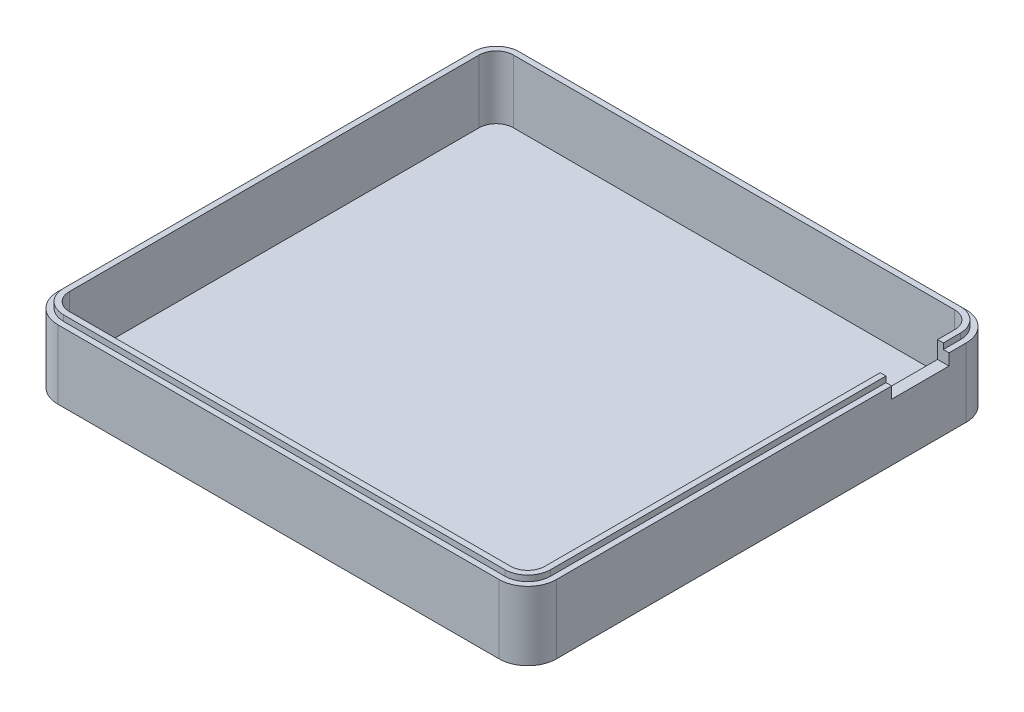
ISO-10303-21;
HEADER;
FILE_DESCRIPTION(('STEP AP214'),'2;1');
FILE_NAME('part.step','',(''),(''),'','','');
FILE_SCHEMA(('AUTOMOTIVE_DESIGN { 1 0 10303 214 1 1 1 1 }'));
ENDSEC;
DATA;
#1=APPLICATION_CONTEXT('core data for automotive mechanical design processes');
#2=APPLICATION_PROTOCOL_DEFINITION('international standard','automotive_design',2000,#1);
#3=PRODUCT_CONTEXT('',#1,'mechanical');
#4=PRODUCT('Part','Part','',(#3));
#5=PRODUCT_RELATED_PRODUCT_CATEGORY('part','',(#4));
#6=PRODUCT_DEFINITION_FORMATION('','',#4);
#7=PRODUCT_DEFINITION_CONTEXT('part definition',#1,'design');
#8=PRODUCT_DEFINITION('design','',#6,#7);
#9=PRODUCT_DEFINITION_SHAPE('','',#8);
#10=(LENGTH_UNIT() NAMED_UNIT(*) SI_UNIT(.MILLI.,.METRE.));
#11=(NAMED_UNIT(*) PLANE_ANGLE_UNIT() SI_UNIT($,.RADIAN.));
#12=(NAMED_UNIT(*) SI_UNIT($,.STERADIAN.) SOLID_ANGLE_UNIT());
#13=UNCERTAINTY_MEASURE_WITH_UNIT(LENGTH_MEASURE(1.E-05),#10,'distance_accuracy_value','');
#14=(GEOMETRIC_REPRESENTATION_CONTEXT(3) GLOBAL_UNCERTAINTY_ASSIGNED_CONTEXT((#13)) GLOBAL_UNIT_ASSIGNED_CONTEXT((#10,
#11,#12)) REPRESENTATION_CONTEXT('',''));
#15=CARTESIAN_POINT('',(0.,0.,0.));
#16=DIRECTION('',(0.,0.,1.));
#17=DIRECTION('',(1.,0.,0.));
#18=AXIS2_PLACEMENT_3D('',#15,#16,#17);
#19=CARTESIAN_POINT('',(83.9156253982292,13.,1.44944630586448));
#20=DIRECTION('',(-1.,0.,0.));
#21=DIRECTION('',(0.,0.,1.));
#22=AXIS2_PLACEMENT_3D('',#19,#20,#21);
#23=PLANE('',#22);
#24=DIRECTION('',(0.,0.,-1.));
#25=VECTOR('',#24,1.);
#26=CARTESIAN_POINT('',(83.9156253982292,13.,1.44944630586448));
#27=LINE('',#26,#25);
#28=CARTESIAN_POINT('',(83.9156253982292,13.,4.44944630586446));
#29=VERTEX_POINT('',#28);
#30=CARTESIAN_POINT('',(83.9156253982292,13.,1.44944630586446));
#31=VERTEX_POINT('',#30);
#32=EDGE_CURVE('E536',#29,#31,#27,.T.);
#33=ORIENTED_EDGE('',*,*,#32,.F.);
#34=DIRECTION('',(0.,1.,0.));
#35=VECTOR('',#34,1.);
#36=CARTESIAN_POINT('',(83.9156253982292,15.,4.44944630586446));
#37=LINE('',#36,#35);
#38=CARTESIAN_POINT('',(83.9156253982292,12.,4.44944630586446));
#39=VERTEX_POINT('',#38);
#40=EDGE_CURVE('E615',#39,#29,#37,.T.);
#41=ORIENTED_EDGE('',*,*,#40,.F.);
#42=DIRECTION('',(0.,0.,-1.));
#43=VECTOR('',#42,1.);
#44=CARTESIAN_POINT('',(83.9156253982292,12.,1.44944630586448));
#45=LINE('',#44,#43);
#46=CARTESIAN_POINT('',(83.9156253982292,12.,1.44944630586446));
#47=VERTEX_POINT('',#46);
#48=EDGE_CURVE('E317',#39,#47,#45,.T.);
#49=ORIENTED_EDGE('',*,*,#48,.T.);
#50=DIRECTION('',(0.,-1.,0.));
#51=VECTOR('',#50,1.);
#52=CARTESIAN_POINT('',(83.9156253982292,13.,1.44944630586446));
#53=LINE('',#52,#51);
#54=EDGE_CURVE('E331',#31,#47,#53,.T.);
#55=ORIENTED_EDGE('',*,*,#54,.F.);
#56=EDGE_LOOP('',(#33,#41,#49,#55));
#57=FACE_BOUND('',#56,.T.);
#58=ADVANCED_FACE('F86',(#57),#23,.F.);
#59=CARTESIAN_POINT('',(2.91562539822915,2.,1.44944630586448));
#60=DIRECTION('',(0.,1.,0.));
#61=DIRECTION('',(0.,0.,1.));
#62=AXIS2_PLACEMENT_3D('',#59,#60,#61);
#63=PLANE('',#62);
#64=CARTESIAN_POINT('',(2.91562539822915,2.,1.44944630586448));
#65=DIRECTION('',(0.,1.,0.));
#66=DIRECTION('',(0.,0.,1.));
#67=AXIS2_PLACEMENT_3D('',#64,#65,#66);
#68=CIRCLE('',#67,3.00000000000002);
#69=CARTESIAN_POINT('',(-0.0843746017708674,2.,1.44944630586448));
#70=VERTEX_POINT('',#69);
#71=CARTESIAN_POINT('',(2.91562539822915,2.,-1.55055369413554));
#72=VERTEX_POINT('',#71);
#73=EDGE_CURVE('E441',#70,#72,#68,.F.);
#74=ORIENTED_EDGE('',*,*,#73,.F.);
#75=DIRECTION('',(0.,0.,-1.));
#76=VECTOR('',#75,1.);
#77=CARTESIAN_POINT('',(-0.0843746017708674,2.,1.44944630586448));
#78=LINE('',#77,#76);
#79=CARTESIAN_POINT('',(-0.0843746017708674,2.,72.9494463058644));
#80=VERTEX_POINT('',#79);
#81=EDGE_CURVE('E438',#80,#70,#78,.T.);
#82=ORIENTED_EDGE('',*,*,#81,.F.);
#83=CARTESIAN_POINT('',(2.91562539822916,2.,72.9494463058644));
#84=DIRECTION('',(0.,1.,0.));
#85=DIRECTION('',(0.,0.,1.));
#86=AXIS2_PLACEMENT_3D('',#83,#84,#85);
#87=CIRCLE('',#86,3.00000000000001);
#88=CARTESIAN_POINT('',(2.91562539822916,2.,75.9494463058645));
#89=VERTEX_POINT('',#88);
#90=EDGE_CURVE('E435',#89,#80,#87,.F.);
#91=ORIENTED_EDGE('',*,*,#90,.F.);
#92=DIRECTION('',(-1.,0.,0.));
#93=VECTOR('',#92,1.);
#94=CARTESIAN_POINT('',(2.91562539822915,2.,75.9494463058645));
#95=LINE('',#94,#93);
#96=CARTESIAN_POINT('',(79.9156253982292,2.,75.9494463058645));
#97=VERTEX_POINT('',#96);
#98=EDGE_CURVE('E432',#97,#89,#95,.T.);
#99=ORIENTED_EDGE('',*,*,#98,.F.);
#100=CARTESIAN_POINT('',(79.9156253982292,2.,72.9494463058644));
#101=DIRECTION('',(0.,1.,0.));
#102=DIRECTION('',(0.,0.,1.));
#103=AXIS2_PLACEMENT_3D('',#100,#101,#102);
#104=CIRCLE('',#103,3.00000000000002);
#105=CARTESIAN_POINT('',(82.9156253982292,2.,72.9494463058644));
#106=VERTEX_POINT('',#105);
#107=EDGE_CURVE('E429',#106,#97,#104,.F.);
#108=ORIENTED_EDGE('',*,*,#107,.F.);
#109=DIRECTION('',(0.,0.,-1.));
#110=VECTOR('',#109,1.);
#111=CARTESIAN_POINT('',(82.9156253982292,2.,1.44944630586448));
#112=LINE('',#111,#110);
#113=CARTESIAN_POINT('',(82.9156253982292,2.,1.44944630586447));
#114=VERTEX_POINT('',#113);
#115=EDGE_CURVE('E425',#106,#114,#112,.T.);
#116=ORIENTED_EDGE('',*,*,#115,.T.);
#117=CARTESIAN_POINT('',(79.9156253982292,2.,1.44944630586447));
#118=DIRECTION('',(0.,1.,0.));
#119=DIRECTION('',(0.,0.,1.));
#120=AXIS2_PLACEMENT_3D('',#117,#118,#119);
#121=CIRCLE('',#120,3.00000000000002);
#122=CARTESIAN_POINT('',(79.9156253982292,2.,-1.55055369413555));
#123=VERTEX_POINT('',#122);
#124=EDGE_CURVE('E421',#114,#123,#121,.T.);
#125=ORIENTED_EDGE('',*,*,#124,.T.);
#126=DIRECTION('',(-1.,0.,0.));
#127=VECTOR('',#126,1.);
#128=CARTESIAN_POINT('',(2.91562539822915,2.,-1.55055369413554));
#129=LINE('',#128,#127);
#130=EDGE_CURVE('E417',#123,#72,#129,.T.);
#131=ORIENTED_EDGE('',*,*,#130,.T.);
#132=EDGE_LOOP('',(#74,#82,#91,#99,#108,#116,#125,#131));
#133=FACE_BOUND('',#132,.T.);
#134=ADVANCED_FACE('F697',(#133),#63,.T.);
#135=CARTESIAN_POINT('',(2.91562539822915,12.,-1.55055369413554));
#136=DIRECTION('',(0.,0.,-1.));
#137=DIRECTION('',(-1.,0.,0.));
#138=AXIS2_PLACEMENT_3D('',#135,#136,#137);
#139=PLANE('',#138);
#140=ORIENTED_EDGE('',*,*,#130,.F.);
#141=DIRECTION('',(0.,-1.,0.));
#142=VECTOR('',#141,1.);
#143=CARTESIAN_POINT('',(79.9156253982292,12.,-1.55055369413555));
#144=LINE('',#143,#142);
#145=CARTESIAN_POINT('',(79.9156253982292,13.,-1.55055369413555));
#146=VERTEX_POINT('',#145);
#147=EDGE_CURVE('E110',#146,#123,#144,.T.);
#148=ORIENTED_EDGE('',*,*,#147,.F.);
#149=DIRECTION('',(-1.,0.,0.));
#150=VECTOR('',#149,1.);
#151=CARTESIAN_POINT('',(2.91562539822915,13.,-1.55055369413554));
#152=LINE('',#151,#150);
#153=CARTESIAN_POINT('',(2.91562539822915,13.,-1.55055369413554));
#154=VERTEX_POINT('',#153);
#155=EDGE_CURVE('E645',#146,#154,#152,.T.);
#156=ORIENTED_EDGE('',*,*,#155,.T.);
#157=DIRECTION('',(0.,-1.,0.));
#158=VECTOR('',#157,1.);
#159=CARTESIAN_POINT('',(2.91562539822915,12.,-1.55055369413554));
#160=LINE('',#159,#158);
#161=EDGE_CURVE('E357',#154,#72,#160,.T.);
#162=ORIENTED_EDGE('',*,*,#161,.T.);
#163=EDGE_LOOP('',(#140,#148,#156,#162));
#164=FACE_BOUND('',#163,.T.);
#165=ADVANCED_FACE('F713',(#164),#139,.F.);
#166=CARTESIAN_POINT('',(79.9156253982292,12.,1.44944630586447));
#167=DIRECTION('',(0.,-1.,0.));
#168=DIRECTION('',(0.,0.,-1.));
#169=AXIS2_PLACEMENT_3D('',#166,#167,#168);
#170=CYLINDRICAL_SURFACE('',#169,3.00000000000002);
#171=ORIENTED_EDGE('',*,*,#124,.F.);
#172=DIRECTION('',(0.,-1.,0.));
#173=VECTOR('',#172,1.);
#174=CARTESIAN_POINT('',(82.9156253982292,12.,1.44944630586447));
#175=LINE('',#174,#173);
#176=CARTESIAN_POINT('',(82.9156253982292,13.,1.44944630586446));
#177=VERTEX_POINT('',#176);
#178=EDGE_CURVE('E362',#177,#114,#175,.T.);
#179=ORIENTED_EDGE('',*,*,#178,.F.);
#180=CARTESIAN_POINT('',(79.9156253982292,13.,1.44944630586447));
#181=DIRECTION('',(0.,1.,0.));
#182=DIRECTION('',(0.,0.,1.));
#183=AXIS2_PLACEMENT_3D('',#180,#181,#182);
#184=CIRCLE('',#183,3.00000000000002);
#185=EDGE_CURVE('E642',#177,#146,#184,.T.);
#186=ORIENTED_EDGE('',*,*,#185,.T.);
#187=ORIENTED_EDGE('',*,*,#147,.T.);
#188=EDGE_LOOP('',(#171,#179,#186,#187));
#189=FACE_BOUND('',#188,.T.);
#190=ADVANCED_FACE('F693',(#189),#170,.F.);
#191=CARTESIAN_POINT('',(82.9156253982292,12.,1.44944630586447));
#192=DIRECTION('',(1.,0.,0.));
#193=DIRECTION('',(0.,0.,-1.));
#194=AXIS2_PLACEMENT_3D('',#191,#192,#193);
#195=PLANE('',#194);
#196=DIRECTION('',(0.,0.,1.));
#197=VECTOR('',#196,1.);
#198=CARTESIAN_POINT('',(82.9156253982292,10.,14.4494463058645));
#199=LINE('',#198,#197);
#200=CARTESIAN_POINT('',(82.9156253982292,10.,4.44944630586446));
#201=VERTEX_POINT('',#200);
#202=CARTESIAN_POINT('',(82.9156253982292,10.,14.4494463058645));
#203=VERTEX_POINT('',#202);
#204=EDGE_CURVE('E633',#201,#203,#199,.T.);
#205=ORIENTED_EDGE('',*,*,#204,.F.);
#206=DIRECTION('',(0.,-1.,0.));
#207=VECTOR('',#206,1.);
#208=CARTESIAN_POINT('',(82.9156253982292,15.,4.44944630586446));
#209=LINE('',#208,#207);
#210=CARTESIAN_POINT('',(82.9156253982292,13.,4.44944630586446));
#211=VERTEX_POINT('',#210);
#212=EDGE_CURVE('E308',#211,#201,#209,.T.);
#213=ORIENTED_EDGE('',*,*,#212,.F.);
#214=DIRECTION('',(0.,0.,-1.));
#215=VECTOR('',#214,1.);
#216=CARTESIAN_POINT('',(82.9156253982292,13.,1.44944630586448));
#217=LINE('',#216,#215);
#218=EDGE_CURVE('E666',#211,#177,#217,.T.);
#219=ORIENTED_EDGE('',*,*,#218,.T.);
#220=ORIENTED_EDGE('',*,*,#178,.T.);
#221=ORIENTED_EDGE('',*,*,#115,.F.);
#222=DIRECTION('',(0.,-1.,0.));
#223=VECTOR('',#222,1.);
#224=CARTESIAN_POINT('',(82.9156253982292,12.,72.9494463058644));
#225=LINE('',#224,#223);
#226=CARTESIAN_POINT('',(82.9156253982292,13.,72.9494463058644));
#227=VERTEX_POINT('',#226);
#228=EDGE_CURVE('E366',#227,#106,#225,.T.);
#229=ORIENTED_EDGE('',*,*,#228,.F.);
#230=CARTESIAN_POINT('',(82.9156253982292,13.,14.4494463058645));
#231=VERTEX_POINT('',#230);
#232=EDGE_CURVE('E560',#227,#231,#217,.T.);
#233=ORIENTED_EDGE('',*,*,#232,.T.);
#234=DIRECTION('',(0.,1.,0.));
#235=VECTOR('',#234,1.);
#236=CARTESIAN_POINT('',(82.9156253982292,15.,14.4494463058645));
#237=LINE('',#236,#235);
#238=EDGE_CURVE('E102',#203,#231,#237,.T.);
#239=ORIENTED_EDGE('',*,*,#238,.F.);
#240=EDGE_LOOP('',(#205,#213,#219,#220,#221,#229,#233,#239));
#241=FACE_BOUND('',#240,.T.);
#242=ADVANCED_FACE('F678',(#241),#195,.F.);
#243=CARTESIAN_POINT('',(79.9156253982292,12.,72.9494463058644));
#244=DIRECTION('',(0.,-1.,0.));
#245=DIRECTION('',(0.,0.,-1.));
#246=AXIS2_PLACEMENT_3D('',#243,#244,#245);
#247=CYLINDRICAL_SURFACE('',#246,3.00000000000002);
#248=ORIENTED_EDGE('',*,*,#228,.T.);
#249=ORIENTED_EDGE('',*,*,#107,.T.);
#250=DIRECTION('',(0.,-1.,0.));
#251=VECTOR('',#250,1.);
#252=CARTESIAN_POINT('',(79.9156253982292,12.,75.9494463058645));
#253=LINE('',#252,#251);
#254=CARTESIAN_POINT('',(79.9156253982292,13.,75.9494463058645));
#255=VERTEX_POINT('',#254);
#256=EDGE_CURVE('E370',#255,#97,#253,.T.);
#257=ORIENTED_EDGE('',*,*,#256,.F.);
#258=CARTESIAN_POINT('',(79.9156253982292,13.,72.9494463058644));
#259=DIRECTION('',(0.,1.,0.));
#260=DIRECTION('',(0.,0.,1.));
#261=AXIS2_PLACEMENT_3D('',#258,#259,#260);
#262=CIRCLE('',#261,3.00000000000002);
#263=EDGE_CURVE('E663',#255,#227,#262,.T.);
#264=ORIENTED_EDGE('',*,*,#263,.T.);
#265=EDGE_LOOP('',(#248,#249,#257,#264));
#266=FACE_BOUND('',#265,.T.);
#267=ADVANCED_FACE('F700',(#266),#247,.F.);
#268=CARTESIAN_POINT('',(2.91562539822918,12.,75.9494463058645));
#269=DIRECTION('',(0.,0.,-1.));
#270=DIRECTION('',(-1.,0.,0.));
#271=AXIS2_PLACEMENT_3D('',#268,#269,#270);
#272=PLANE('',#271);
#273=ORIENTED_EDGE('',*,*,#256,.T.);
#274=ORIENTED_EDGE('',*,*,#98,.T.);
#275=DIRECTION('',(0.,-1.,0.));
#276=VECTOR('',#275,1.);
#277=CARTESIAN_POINT('',(2.91562539822916,12.,75.9494463058645));
#278=LINE('',#277,#276);
#279=CARTESIAN_POINT('',(2.91562539822915,13.,75.9494463058645));
#280=VERTEX_POINT('',#279);
#281=EDGE_CURVE('E374',#280,#89,#278,.T.);
#282=ORIENTED_EDGE('',*,*,#281,.F.);
#283=DIRECTION('',(-1.,0.,0.));
#284=VECTOR('',#283,1.);
#285=CARTESIAN_POINT('',(2.91562539822915,13.,75.9494463058645));
#286=LINE('',#285,#284);
#287=EDGE_CURVE('E660',#255,#280,#286,.T.);
#288=ORIENTED_EDGE('',*,*,#287,.F.);
#289=EDGE_LOOP('',(#273,#274,#282,#288));
#290=FACE_BOUND('',#289,.T.);
#291=ADVANCED_FACE('F703',(#290),#272,.T.);
#292=CARTESIAN_POINT('',(2.91562539822916,12.,72.9494463058644));
#293=DIRECTION('',(0.,-1.,0.));
#294=DIRECTION('',(0.,0.,-1.));
#295=AXIS2_PLACEMENT_3D('',#292,#293,#294);
#296=CYLINDRICAL_SURFACE('',#295,3.00000000000001);
#297=ORIENTED_EDGE('',*,*,#281,.T.);
#298=ORIENTED_EDGE('',*,*,#90,.T.);
#299=DIRECTION('',(0.,-1.,0.));
#300=VECTOR('',#299,1.);
#301=CARTESIAN_POINT('',(-0.0843746017708674,12.,72.9494463058644));
#302=LINE('',#301,#300);
#303=CARTESIAN_POINT('',(-0.0843746017708574,13.,72.9494463058644));
#304=VERTEX_POINT('',#303);
#305=EDGE_CURVE('E378',#304,#80,#302,.T.);
#306=ORIENTED_EDGE('',*,*,#305,.F.);
#307=CARTESIAN_POINT('',(2.91562539822916,13.,72.9494463058644));
#308=DIRECTION('',(0.,1.,0.));
#309=DIRECTION('',(0.,0.,1.));
#310=AXIS2_PLACEMENT_3D('',#307,#308,#309);
#311=CIRCLE('',#310,3.00000000000001);
#312=EDGE_CURVE('E656',#304,#280,#311,.T.);
#313=ORIENTED_EDGE('',*,*,#312,.T.);
#314=EDGE_LOOP('',(#297,#298,#306,#313));
#315=FACE_BOUND('',#314,.T.);
#316=ADVANCED_FACE('F707',(#315),#296,.F.);
#317=CARTESIAN_POINT('',(-0.0843746017708674,12.,1.44944630586448));
#318=DIRECTION('',(1.,0.,0.));
#319=DIRECTION('',(0.,0.,-1.));
#320=AXIS2_PLACEMENT_3D('',#317,#318,#319);
#321=PLANE('',#320);
#322=ORIENTED_EDGE('',*,*,#305,.T.);
#323=ORIENTED_EDGE('',*,*,#81,.T.);
#324=DIRECTION('',(0.,-1.,0.));
#325=VECTOR('',#324,1.);
#326=CARTESIAN_POINT('',(-0.0843746017708674,12.,1.44944630586448));
#327=LINE('',#326,#325);
#328=CARTESIAN_POINT('',(-0.0843746017708674,13.,1.44944630586448));
#329=VERTEX_POINT('',#328);
#330=EDGE_CURVE('E382',#329,#70,#327,.T.);
#331=ORIENTED_EDGE('',*,*,#330,.F.);
#332=DIRECTION('',(0.,0.,-1.));
#333=VECTOR('',#332,1.);
#334=CARTESIAN_POINT('',(-0.0843746017708674,13.,1.44944630586448));
#335=LINE('',#334,#333);
#336=EDGE_CURVE('E652',#304,#329,#335,.T.);
#337=ORIENTED_EDGE('',*,*,#336,.F.);
#338=EDGE_LOOP('',(#322,#323,#331,#337));
#339=FACE_BOUND('',#338,.T.);
#340=ADVANCED_FACE('F710',(#339),#321,.T.);
#341=CARTESIAN_POINT('',(2.91562539822915,12.,1.44944630586448));
#342=DIRECTION('',(0.,-1.,0.));
#343=DIRECTION('',(0.,0.,-1.));
#344=AXIS2_PLACEMENT_3D('',#341,#342,#343);
#345=CYLINDRICAL_SURFACE('',#344,3.00000000000002);
#346=ORIENTED_EDGE('',*,*,#330,.T.);
#347=ORIENTED_EDGE('',*,*,#73,.T.);
#348=ORIENTED_EDGE('',*,*,#161,.F.);
#349=CARTESIAN_POINT('',(2.91562539822915,13.,1.44944630586448));
#350=DIRECTION('',(0.,1.,0.));
#351=DIRECTION('',(0.,0.,1.));
#352=AXIS2_PLACEMENT_3D('',#349,#350,#351);
#353=CIRCLE('',#352,3.00000000000002);
#354=EDGE_CURVE('E648',#154,#329,#353,.T.);
#355=ORIENTED_EDGE('',*,*,#354,.T.);
#356=EDGE_LOOP('',(#346,#347,#348,#355));
#357=FACE_BOUND('',#356,.T.);
#358=ADVANCED_FACE('F712',(#357),#345,.F.);
#359=CARTESIAN_POINT('',(2.91562539822915,2.,1.44944630586448));
#360=DIRECTION('',(0.,-1.,0.));
#361=DIRECTION('',(0.,0.,-1.));
#362=AXIS2_PLACEMENT_3D('',#359,#360,#361);
#363=CYLINDRICAL_SURFACE('',#362,5.00000000000002);
#364=CARTESIAN_POINT('',(2.91562539822915,0.,1.44944630586448));
#365=DIRECTION('',(0.,1.,0.));
#366=DIRECTION('',(0.,0.,1.));
#367=AXIS2_PLACEMENT_3D('',#364,#365,#366);
#368=CIRCLE('',#367,5.00000000000002);
#369=CARTESIAN_POINT('',(2.91562539822915,0.,-3.55055369413555));
#370=VERTEX_POINT('',#369);
#371=CARTESIAN_POINT('',(-2.08437460177085,0.,1.44944630586448));
#372=VERTEX_POINT('',#371);
#373=EDGE_CURVE('E445',#370,#372,#368,.T.);
#374=ORIENTED_EDGE('',*,*,#373,.T.);
#375=DIRECTION('',(0.,-1.,0.));
#376=VECTOR('',#375,1.);
#377=CARTESIAN_POINT('',(-2.08437460177085,2.,1.44944630586448));
#378=LINE('',#377,#376);
#379=CARTESIAN_POINT('',(-2.08437460177085,12.,1.44944630586448));
#380=VERTEX_POINT('',#379);
#381=EDGE_CURVE('E12',#380,#372,#378,.T.);
#382=ORIENTED_EDGE('',*,*,#381,.F.);
#383=CARTESIAN_POINT('',(2.91562539822915,12.,1.44944630586448));
#384=DIRECTION('',(0.,1.,0.));
#385=DIRECTION('',(0.,0.,1.));
#386=AXIS2_PLACEMENT_3D('',#383,#384,#385);
#387=CIRCLE('',#386,5.00000000000002);
#388=CARTESIAN_POINT('',(2.91562539822915,12.,-3.55055369413555));
#389=VERTEX_POINT('',#388);
#390=EDGE_CURVE('E386',#389,#380,#387,.T.);
#391=ORIENTED_EDGE('',*,*,#390,.F.);
#392=DIRECTION('',(0.,-1.,0.));
#393=VECTOR('',#392,1.);
#394=CARTESIAN_POINT('',(2.91562539822915,2.,-3.55055369413555));
#395=LINE('',#394,#393);
#396=EDGE_CURVE('E474',#389,#370,#395,.T.);
#397=ORIENTED_EDGE('',*,*,#396,.T.);
#398=EDGE_LOOP('',(#374,#382,#391,#397));
#399=FACE_BOUND('',#398,.T.);
#400=ADVANCED_FACE('F88',(#399),#363,.T.);
#401=CARTESIAN_POINT('',(-2.08437460177085,2.,1.44944630586448));
#402=DIRECTION('',(1.,0.,0.));
#403=DIRECTION('',(0.,0.,-1.));
#404=AXIS2_PLACEMENT_3D('',#401,#402,#403);
#405=PLANE('',#404);
#406=DIRECTION('',(0.,0.,1.));
#407=VECTOR('',#406,1.);
#408=CARTESIAN_POINT('',(-2.08437460177085,0.,1.44944630586448));
#409=LINE('',#408,#407);
#410=CARTESIAN_POINT('',(-2.08437460177085,0.,72.9494463058644));
#411=VERTEX_POINT('',#410);
#412=EDGE_CURVE('E449',#372,#411,#409,.T.);
#413=ORIENTED_EDGE('',*,*,#412,.T.);
#414=DIRECTION('',(0.,-1.,0.));
#415=VECTOR('',#414,1.);
#416=CARTESIAN_POINT('',(-2.08437460177085,2.,72.9494463058644));
#417=LINE('',#416,#415);
#418=CARTESIAN_POINT('',(-2.08437460177085,12.,72.9494463058644));
#419=VERTEX_POINT('',#418);
#420=EDGE_CURVE('E95',#419,#411,#417,.T.);
#421=ORIENTED_EDGE('',*,*,#420,.F.);
#422=DIRECTION('',(0.,0.,1.));
#423=VECTOR('',#422,1.);
#424=CARTESIAN_POINT('',(-2.08437460177085,12.,1.44944630586448));
#425=LINE('',#424,#423);
#426=EDGE_CURVE('E390',#380,#419,#425,.T.);
#427=ORIENTED_EDGE('',*,*,#426,.F.);
#428=ORIENTED_EDGE('',*,*,#381,.T.);
#429=EDGE_LOOP('',(#413,#421,#427,#428));
#430=FACE_BOUND('',#429,.T.);
#431=ADVANCED_FACE('F515',(#430),#405,.F.);
#432=CARTESIAN_POINT('',(2.91562539822916,2.,72.9494463058644));
#433=DIRECTION('',(0.,-1.,0.));
#434=DIRECTION('',(0.,0.,-1.));
#435=AXIS2_PLACEMENT_3D('',#432,#433,#434);
#436=CYLINDRICAL_SURFACE('',#435,5.00000000000001);
#437=CARTESIAN_POINT('',(2.91562539822916,0.,72.9494463058644));
#438=DIRECTION('',(0.,1.,0.));
#439=DIRECTION('',(0.,0.,1.));
#440=AXIS2_PLACEMENT_3D('',#437,#438,#439);
#441=CIRCLE('',#440,5.00000000000001);
#442=CARTESIAN_POINT('',(2.91562539822916,0.,77.9494463058645));
#443=VERTEX_POINT('',#442);
#444=EDGE_CURVE('E452',#411,#443,#441,.T.);
#445=ORIENTED_EDGE('',*,*,#444,.T.);
#446=DIRECTION('',(0.,-1.,0.));
#447=VECTOR('',#446,1.);
#448=CARTESIAN_POINT('',(2.91562539822916,2.,77.9494463058645));
#449=LINE('',#448,#447);
#450=CARTESIAN_POINT('',(2.91562539822916,12.,77.9494463058645));
#451=VERTEX_POINT('',#450);
#452=EDGE_CURVE('E490',#451,#443,#449,.T.);
#453=ORIENTED_EDGE('',*,*,#452,.F.);
#454=CARTESIAN_POINT('',(2.91562539822916,12.,72.9494463058644));
#455=DIRECTION('',(0.,1.,0.));
#456=DIRECTION('',(0.,0.,1.));
#457=AXIS2_PLACEMENT_3D('',#454,#455,#456);
#458=CIRCLE('',#457,5.00000000000001);
#459=EDGE_CURVE('E394',#419,#451,#458,.T.);
#460=ORIENTED_EDGE('',*,*,#459,.F.);
#461=ORIENTED_EDGE('',*,*,#420,.T.);
#462=EDGE_LOOP('',(#445,#453,#460,#461));
#463=FACE_BOUND('',#462,.T.);
#464=ADVANCED_FACE('F498',(#463),#436,.T.);
#465=CARTESIAN_POINT('',(2.91562539822919,2.,77.9494463058645));
#466=DIRECTION('',(0.,0.,-1.));
#467=DIRECTION('',(-1.,0.,0.));
#468=AXIS2_PLACEMENT_3D('',#465,#466,#467);
#469=PLANE('',#468);
#470=DIRECTION('',(1.,0.,0.));
#471=VECTOR('',#470,1.);
#472=CARTESIAN_POINT('',(2.91562539822919,0.,77.9494463058645));
#473=LINE('',#472,#471);
#474=CARTESIAN_POINT('',(79.9156253982292,0.,77.9494463058645));
#475=VERTEX_POINT('',#474);
#476=EDGE_CURVE('E455',#443,#475,#473,.T.);
#477=ORIENTED_EDGE('',*,*,#476,.T.);
#478=DIRECTION('',(0.,-1.,0.));
#479=VECTOR('',#478,1.);
#480=CARTESIAN_POINT('',(79.9156253982292,2.,77.9494463058645));
#481=LINE('',#480,#479);
#482=CARTESIAN_POINT('',(79.9156253982292,12.,77.9494463058645));
#483=VERTEX_POINT('',#482);
#484=EDGE_CURVE('E486',#483,#475,#481,.T.);
#485=ORIENTED_EDGE('',*,*,#484,.F.);
#486=DIRECTION('',(1.,0.,0.));
#487=VECTOR('',#486,1.);
#488=CARTESIAN_POINT('',(2.91562539822919,12.,77.9494463058645));
#489=LINE('',#488,#487);
#490=EDGE_CURVE('E398',#451,#483,#489,.T.);
#491=ORIENTED_EDGE('',*,*,#490,.F.);
#492=ORIENTED_EDGE('',*,*,#452,.T.);
#493=EDGE_LOOP('',(#477,#485,#491,#492));
#494=FACE_BOUND('',#493,.T.);
#495=ADVANCED_FACE('F507',(#494),#469,.F.);
#496=CARTESIAN_POINT('',(79.9156253982292,2.,72.9494463058644));
#497=DIRECTION('',(0.,-1.,0.));
#498=DIRECTION('',(0.,0.,-1.));
#499=AXIS2_PLACEMENT_3D('',#496,#497,#498);
#500=CYLINDRICAL_SURFACE('',#499,5.00000000000001);
#501=CARTESIAN_POINT('',(79.9156253982292,0.,72.9494463058644));
#502=DIRECTION('',(0.,1.,0.));
#503=DIRECTION('',(0.,0.,1.));
#504=AXIS2_PLACEMENT_3D('',#501,#502,#503);
#505=CIRCLE('',#504,5.00000000000001);
#506=CARTESIAN_POINT('',(84.9156253982292,0.,72.9494463058644));
#507=VERTEX_POINT('',#506);
#508=EDGE_CURVE('E458',#475,#507,#505,.T.);
#509=ORIENTED_EDGE('',*,*,#508,.T.);
#510=DIRECTION('',(0.,-1.,0.));
#511=VECTOR('',#510,1.);
#512=CARTESIAN_POINT('',(84.9156253982292,2.,72.9494463058644));
#513=LINE('',#512,#511);
#514=CARTESIAN_POINT('',(84.9156253982292,12.,72.9494463058644));
#515=VERTEX_POINT('',#514);
#516=EDGE_CURVE('E483',#515,#507,#513,.T.);
#517=ORIENTED_EDGE('',*,*,#516,.F.);
#518=CARTESIAN_POINT('',(79.9156253982292,12.,72.9494463058644));
#519=DIRECTION('',(0.,1.,0.));
#520=DIRECTION('',(0.,0.,1.));
#521=AXIS2_PLACEMENT_3D('',#518,#519,#520);
#522=CIRCLE('',#521,5.00000000000001);
#523=EDGE_CURVE('E402',#483,#515,#522,.T.);
#524=ORIENTED_EDGE('',*,*,#523,.F.);
#525=ORIENTED_EDGE('',*,*,#484,.T.);
#526=EDGE_LOOP('',(#509,#517,#524,#525));
#527=FACE_BOUND('',#526,.T.);
#528=ADVANCED_FACE('F511',(#527),#500,.T.);
#529=CARTESIAN_POINT('',(84.9156253982292,2.,1.44944630586447));
#530=DIRECTION('',(1.,0.,0.));
#531=DIRECTION('',(0.,0.,-1.));
#532=AXIS2_PLACEMENT_3D('',#529,#530,#531);
#533=PLANE('',#532);
#534=DIRECTION('',(0.,1.,0.));
#535=VECTOR('',#534,1.);
#536=CARTESIAN_POINT('',(84.9156253982292,15.,4.44944630586446));
#537=LINE('',#536,#535);
#538=CARTESIAN_POINT('',(84.9156253982292,10.,4.44944630586446));
#539=VERTEX_POINT('',#538);
#540=CARTESIAN_POINT('',(84.9156253982292,12.,4.44944630586446));
#541=VERTEX_POINT('',#540);
#542=EDGE_CURVE('E619',#539,#541,#537,.T.);
#543=ORIENTED_EDGE('',*,*,#542,.F.);
#544=DIRECTION('',(0.,0.,-1.));
#545=VECTOR('',#544,1.);
#546=CARTESIAN_POINT('',(84.9156253982292,10.,14.4494463058645));
#547=LINE('',#546,#545);
#548=CARTESIAN_POINT('',(84.9156253982292,10.,14.4494463058645));
#549=VERTEX_POINT('',#548);
#550=EDGE_CURVE('E621',#549,#539,#547,.T.);
#551=ORIENTED_EDGE('',*,*,#550,.F.);
#552=DIRECTION('',(0.,-1.,0.));
#553=VECTOR('',#552,1.);
#554=CARTESIAN_POINT('',(84.9156253982292,15.,14.4494463058645));
#555=LINE('',#554,#553);
#556=CARTESIAN_POINT('',(84.9156253982292,12.,14.4494463058645));
#557=VERTEX_POINT('',#556);
#558=EDGE_CURVE('E296',#557,#549,#555,.T.);
#559=ORIENTED_EDGE('',*,*,#558,.F.);
#560=DIRECTION('',(0.,0.,1.));
#561=VECTOR('',#560,1.);
#562=CARTESIAN_POINT('',(84.9156253982292,12.,1.44944630586447));
#563=LINE('',#562,#561);
#564=EDGE_CURVE('E306',#557,#515,#563,.T.);
#565=ORIENTED_EDGE('',*,*,#564,.T.);
#566=ORIENTED_EDGE('',*,*,#516,.T.);
#567=DIRECTION('',(0.,0.,1.));
#568=VECTOR('',#567,1.);
#569=CARTESIAN_POINT('',(84.9156253982292,0.,1.44944630586447));
#570=LINE('',#569,#568);
#571=CARTESIAN_POINT('',(84.9156253982292,0.,1.44944630586447));
#572=VERTEX_POINT('',#571);
#573=EDGE_CURVE('E462',#572,#507,#570,.T.);
#574=ORIENTED_EDGE('',*,*,#573,.F.);
#575=DIRECTION('',(0.,-1.,0.));
#576=VECTOR('',#575,1.);
#577=CARTESIAN_POINT('',(84.9156253982292,2.,1.44944630586447));
#578=LINE('',#577,#576);
#579=CARTESIAN_POINT('',(84.9156253982292,12.,1.44944630586447));
#580=VERTEX_POINT('',#579);
#581=EDGE_CURVE('E480',#580,#572,#578,.T.);
#582=ORIENTED_EDGE('',*,*,#581,.F.);
#583=EDGE_CURVE('E405',#580,#541,#563,.T.);
#584=ORIENTED_EDGE('',*,*,#583,.T.);
#585=EDGE_LOOP('',(#543,#551,#559,#565,#566,#574,#582,#584));
#586=FACE_BOUND('',#585,.T.);
#587=ADVANCED_FACE('F527',(#586),#533,.T.);
#588=CARTESIAN_POINT('',(79.9156253982292,2.,1.44944630586447));
#589=DIRECTION('',(0.,-1.,0.));
#590=DIRECTION('',(0.,0.,-1.));
#591=AXIS2_PLACEMENT_3D('',#588,#589,#590);
#592=CYLINDRICAL_SURFACE('',#591,5.);
#593=CARTESIAN_POINT('',(79.9156253982292,0.,1.44944630586447));
#594=DIRECTION('',(0.,-1.,0.));
#595=DIRECTION('',(0.,0.,-1.));
#596=AXIS2_PLACEMENT_3D('',#593,#594,#595);
#597=CIRCLE('',#596,5.);
#598=CARTESIAN_POINT('',(79.9156253982292,0.,-3.55055369413554));
#599=VERTEX_POINT('',#598);
#600=EDGE_CURVE('E466',#599,#572,#597,.T.);
#601=ORIENTED_EDGE('',*,*,#600,.F.);
#602=DIRECTION('',(0.,-1.,0.));
#603=VECTOR('',#602,1.);
#604=CARTESIAN_POINT('',(79.9156253982292,2.,-3.55055369413554));
#605=LINE('',#604,#603);
#606=CARTESIAN_POINT('',(79.9156253982292,12.,-3.55055369413554));
#607=VERTEX_POINT('',#606);
#608=EDGE_CURVE('E477',#607,#599,#605,.T.);
#609=ORIENTED_EDGE('',*,*,#608,.F.);
#610=CARTESIAN_POINT('',(79.9156253982292,12.,1.44944630586447));
#611=DIRECTION('',(0.,-1.,0.));
#612=DIRECTION('',(0.,0.,-1.));
#613=AXIS2_PLACEMENT_3D('',#610,#611,#612);
#614=CIRCLE('',#613,5.);
#615=EDGE_CURVE('E409',#607,#580,#614,.T.);
#616=ORIENTED_EDGE('',*,*,#615,.T.);
#617=ORIENTED_EDGE('',*,*,#581,.T.);
#618=EDGE_LOOP('',(#601,#609,#616,#617));
#619=FACE_BOUND('',#618,.T.);
#620=ADVANCED_FACE('F523',(#619),#592,.T.);
#621=CARTESIAN_POINT('',(2.91562539822915,2.,-3.55055369413555));
#622=DIRECTION('',(0.,0.,-1.));
#623=DIRECTION('',(-1.,0.,0.));
#624=AXIS2_PLACEMENT_3D('',#621,#622,#623);
#625=PLANE('',#624);
#626=DIRECTION('',(1.,0.,0.));
#627=VECTOR('',#626,1.);
#628=CARTESIAN_POINT('',(2.91562539822915,0.,-3.55055369413555));
#629=LINE('',#628,#627);
#630=EDGE_CURVE('E470',#370,#599,#629,.T.);
#631=ORIENTED_EDGE('',*,*,#630,.F.);
#632=ORIENTED_EDGE('',*,*,#396,.F.);
#633=DIRECTION('',(1.,0.,0.));
#634=VECTOR('',#633,1.);
#635=CARTESIAN_POINT('',(2.91562539822915,12.,-3.55055369413555));
#636=LINE('',#635,#634);
#637=EDGE_CURVE('E413',#389,#607,#636,.T.);
#638=ORIENTED_EDGE('',*,*,#637,.T.);
#639=ORIENTED_EDGE('',*,*,#608,.T.);
#640=EDGE_LOOP('',(#631,#632,#638,#639));
#641=FACE_BOUND('',#640,.T.);
#642=ADVANCED_FACE('F519',(#641),#625,.T.);
#643=CARTESIAN_POINT('',(2.91562539822915,0.,1.44944630586448));
#644=DIRECTION('',(0.,1.,0.));
#645=DIRECTION('',(0.,0.,1.));
#646=AXIS2_PLACEMENT_3D('',#643,#644,#645);
#647=PLANE('',#646);
#648=ORIENTED_EDGE('',*,*,#373,.F.);
#649=ORIENTED_EDGE('',*,*,#630,.T.);
#650=ORIENTED_EDGE('',*,*,#600,.T.);
#651=ORIENTED_EDGE('',*,*,#573,.T.);
#652=ORIENTED_EDGE('',*,*,#508,.F.);
#653=ORIENTED_EDGE('',*,*,#476,.F.);
#654=ORIENTED_EDGE('',*,*,#444,.F.);
#655=ORIENTED_EDGE('',*,*,#412,.F.);
#656=EDGE_LOOP('',(#648,#649,#650,#651,#652,#653,#654,#655));
#657=FACE_BOUND('',#656,.T.);
#658=ADVANCED_FACE('F504',(#657),#647,.F.);
#659=CARTESIAN_POINT('',(2.91562539822915,12.,1.44944630586448));
#660=DIRECTION('',(0.,1.,0.));
#661=DIRECTION('',(0.,0.,1.));
#662=AXIS2_PLACEMENT_3D('',#659,#660,#661);
#663=PLANE('',#662);
#664=DIRECTION('',(1.,0.,0.));
#665=VECTOR('',#664,1.);
#666=CARTESIAN_POINT('',(-2.08537460177087,12.,4.44944630586446));
#667=LINE('',#666,#665);
#668=EDGE_CURVE('E309',#39,#541,#667,.T.);
#669=ORIENTED_EDGE('',*,*,#668,.T.);
#670=ORIENTED_EDGE('',*,*,#583,.F.);
#671=ORIENTED_EDGE('',*,*,#615,.F.);
#672=ORIENTED_EDGE('',*,*,#637,.F.);
#673=ORIENTED_EDGE('',*,*,#390,.T.);
#674=ORIENTED_EDGE('',*,*,#426,.T.);
#675=ORIENTED_EDGE('',*,*,#459,.T.);
#676=ORIENTED_EDGE('',*,*,#490,.T.);
#677=ORIENTED_EDGE('',*,*,#523,.T.);
#678=ORIENTED_EDGE('',*,*,#564,.F.);
#679=DIRECTION('',(-1.,0.,0.));
#680=VECTOR('',#679,1.);
#681=CARTESIAN_POINT('',(-2.08537460177087,12.,14.4494463058645));
#682=LINE('',#681,#680);
#683=CARTESIAN_POINT('',(83.9156253982292,12.,14.4494463058645));
#684=VERTEX_POINT('',#683);
#685=EDGE_CURVE('E288',#557,#684,#682,.T.);
#686=ORIENTED_EDGE('',*,*,#685,.T.);
#687=CARTESIAN_POINT('',(83.9156253982292,12.,72.9494463058644));
#688=VERTEX_POINT('',#687);
#689=EDGE_CURVE('E304',#688,#684,#45,.T.);
#690=ORIENTED_EDGE('',*,*,#689,.F.);
#691=CARTESIAN_POINT('',(79.9156253982292,12.,72.9494463058644));
#692=DIRECTION('',(0.,1.,0.));
#693=DIRECTION('',(0.,0.,1.));
#694=AXIS2_PLACEMENT_3D('',#691,#692,#693);
#695=CIRCLE('',#694,4.00000000000001);
#696=CARTESIAN_POINT('',(79.9156253982292,12.,76.9494463058645));
#697=VERTEX_POINT('',#696);
#698=EDGE_CURVE('E323',#697,#688,#695,.T.);
#699=ORIENTED_EDGE('',*,*,#698,.F.);
#700=DIRECTION('',(1.,0.,0.));
#701=VECTOR('',#700,1.);
#702=CARTESIAN_POINT('',(2.91562539822915,12.,76.9494463058645));
#703=LINE('',#702,#701);
#704=CARTESIAN_POINT('',(2.91562539822916,12.,76.9494463058645));
#705=VERTEX_POINT('',#704);
#706=EDGE_CURVE('E575',#705,#697,#703,.T.);
#707=ORIENTED_EDGE('',*,*,#706,.F.);
#708=CARTESIAN_POINT('',(2.91562539822916,12.,72.9494463058644));
#709=DIRECTION('',(0.,1.,0.));
#710=DIRECTION('',(0.,0.,1.));
#711=AXIS2_PLACEMENT_3D('',#708,#709,#710);
#712=CIRCLE('',#711,4.00000000000001);
#713=CARTESIAN_POINT('',(-1.08437460177085,12.,72.9494463058644));
#714=VERTEX_POINT('',#713);
#715=EDGE_CURVE('E573',#714,#705,#712,.T.);
#716=ORIENTED_EDGE('',*,*,#715,.F.);
#717=DIRECTION('',(0.,0.,1.));
#718=VECTOR('',#717,1.);
#719=CARTESIAN_POINT('',(-1.08437460177087,12.,1.44944630586448));
#720=LINE('',#719,#718);
#721=CARTESIAN_POINT('',(-1.08437460177087,12.,1.44944630586447));
#722=VERTEX_POINT('',#721);
#723=EDGE_CURVE('E570',#722,#714,#720,.T.);
#724=ORIENTED_EDGE('',*,*,#723,.F.);
#725=CARTESIAN_POINT('',(2.91562539822915,12.,1.44944630586448));
#726=DIRECTION('',(0.,1.,0.));
#727=DIRECTION('',(0.,0.,1.));
#728=AXIS2_PLACEMENT_3D('',#725,#726,#727);
#729=CIRCLE('',#728,4.00000000000002);
#730=CARTESIAN_POINT('',(2.91562539822915,12.,-2.55055369413554));
#731=VERTEX_POINT('',#730);
#732=EDGE_CURVE('E567',#731,#722,#729,.T.);
#733=ORIENTED_EDGE('',*,*,#732,.F.);
#734=DIRECTION('',(-1.,0.,0.));
#735=VECTOR('',#734,1.);
#736=CARTESIAN_POINT('',(2.91562539822915,12.,-2.55055369413554));
#737=LINE('',#736,#735);
#738=CARTESIAN_POINT('',(79.9156253982292,12.,-2.55055369413554));
#739=VERTEX_POINT('',#738);
#740=EDGE_CURVE('E563',#739,#731,#737,.T.);
#741=ORIENTED_EDGE('',*,*,#740,.F.);
#742=CARTESIAN_POINT('',(79.9156253982292,12.,1.44944630586447));
#743=DIRECTION('',(0.,1.,0.));
#744=DIRECTION('',(0.,0.,1.));
#745=AXIS2_PLACEMENT_3D('',#742,#743,#744);
#746=CIRCLE('',#745,4.);
#747=EDGE_CURVE('E316',#47,#739,#746,.T.);
#748=ORIENTED_EDGE('',*,*,#747,.F.);
#749=ORIENTED_EDGE('',*,*,#48,.F.);
#750=EDGE_LOOP('',(#669,#670,#671,#672,#673,#674,#675,#676,#677,#678,#686,#690,#699,#707,#716,
#724,#733,#741,#748,#749));
#751=FACE_BOUND('',#750,.T.);
#752=ADVANCED_FACE('F302',(#751),#663,.T.);
#753=CARTESIAN_POINT('',(2.91562539822915,13.,-2.55055369413554));
#754=DIRECTION('',(0.,0.,1.));
#755=DIRECTION('',(1.,0.,0.));
#756=AXIS2_PLACEMENT_3D('',#753,#754,#755);
#757=PLANE('',#756);
#758=ORIENTED_EDGE('',*,*,#740,.T.);
#759=DIRECTION('',(0.,-1.,0.));
#760=VECTOR('',#759,1.);
#761=CARTESIAN_POINT('',(2.91562539822915,13.,-2.55055369413554));
#762=LINE('',#761,#760);
#763=CARTESIAN_POINT('',(2.91562539822915,13.,-2.55055369413554));
#764=VERTEX_POINT('',#763);
#765=EDGE_CURVE('E354',#764,#731,#762,.T.);
#766=ORIENTED_EDGE('',*,*,#765,.F.);
#767=DIRECTION('',(-1.,0.,0.));
#768=VECTOR('',#767,1.);
#769=CARTESIAN_POINT('',(2.91562539822915,13.,-2.55055369413554));
#770=LINE('',#769,#768);
#771=CARTESIAN_POINT('',(79.9156253982292,13.,-2.55055369413554));
#772=VERTEX_POINT('',#771);
#773=EDGE_CURVE('E321',#772,#764,#770,.T.);
#774=ORIENTED_EDGE('',*,*,#773,.F.);
#775=DIRECTION('',(0.,-1.,0.));
#776=VECTOR('',#775,1.);
#777=CARTESIAN_POINT('',(79.9156253982292,13.,-2.55055369413554));
#778=LINE('',#777,#776);
#779=EDGE_CURVE('E327',#772,#739,#778,.T.);
#780=ORIENTED_EDGE('',*,*,#779,.T.);
#781=EDGE_LOOP('',(#758,#766,#774,#780));
#782=FACE_BOUND('',#781,.T.);
#783=ADVANCED_FACE('F606',(#782),#757,.F.);
#784=CARTESIAN_POINT('',(2.91562539822915,13.,1.44944630586448));
#785=DIRECTION('',(0.,-1.,0.));
#786=DIRECTION('',(0.,0.,-1.));
#787=AXIS2_PLACEMENT_3D('',#784,#785,#786);
#788=CYLINDRICAL_SURFACE('',#787,4.00000000000002);
#789=ORIENTED_EDGE('',*,*,#732,.T.);
#790=DIRECTION('',(0.,-1.,0.));
#791=VECTOR('',#790,1.);
#792=CARTESIAN_POINT('',(-1.08437460177087,13.,1.44944630586447));
#793=LINE('',#792,#791);
#794=CARTESIAN_POINT('',(-1.08437460177087,13.,1.44944630586447));
#795=VERTEX_POINT('',#794);
#796=EDGE_CURVE('E350',#795,#722,#793,.T.);
#797=ORIENTED_EDGE('',*,*,#796,.F.);
#798=CARTESIAN_POINT('',(2.91562539822915,13.,1.44944630586448));
#799=DIRECTION('',(0.,1.,0.));
#800=DIRECTION('',(0.,0.,1.));
#801=AXIS2_PLACEMENT_3D('',#798,#799,#800);
#802=CIRCLE('',#801,4.00000000000002);
#803=EDGE_CURVE('E550',#764,#795,#802,.T.);
#804=ORIENTED_EDGE('',*,*,#803,.F.);
#805=ORIENTED_EDGE('',*,*,#765,.T.);
#806=EDGE_LOOP('',(#789,#797,#804,#805));
#807=FACE_BOUND('',#806,.T.);
#808=ADVANCED_FACE('F601',(#807),#788,.T.);
#809=CARTESIAN_POINT('',(-1.08437460177087,13.,1.44944630586448));
#810=DIRECTION('',(1.,0.,0.));
#811=DIRECTION('',(0.,0.,-1.));
#812=AXIS2_PLACEMENT_3D('',#809,#810,#811);
#813=PLANE('',#812);
#814=ORIENTED_EDGE('',*,*,#723,.T.);
#815=DIRECTION('',(0.,-1.,0.));
#816=VECTOR('',#815,1.);
#817=CARTESIAN_POINT('',(-1.08437460177085,13.,72.9494463058644));
#818=LINE('',#817,#816);
#819=CARTESIAN_POINT('',(-1.08437460177085,13.,72.9494463058644));
#820=VERTEX_POINT('',#819);
#821=EDGE_CURVE('E346',#820,#714,#818,.T.);
#822=ORIENTED_EDGE('',*,*,#821,.F.);
#823=DIRECTION('',(0.,0.,1.));
#824=VECTOR('',#823,1.);
#825=CARTESIAN_POINT('',(-1.08437460177087,13.,1.44944630586448));
#826=LINE('',#825,#824);
#827=EDGE_CURVE('E547',#795,#820,#826,.T.);
#828=ORIENTED_EDGE('',*,*,#827,.F.);
#829=ORIENTED_EDGE('',*,*,#796,.T.);
#830=EDGE_LOOP('',(#814,#822,#828,#829));
#831=FACE_BOUND('',#830,.T.);
#832=ADVANCED_FACE('F599',(#831),#813,.F.);
#833=CARTESIAN_POINT('',(2.91562539822916,13.,72.9494463058644));
#834=DIRECTION('',(0.,-1.,0.));
#835=DIRECTION('',(0.,0.,-1.));
#836=AXIS2_PLACEMENT_3D('',#833,#834,#835);
#837=CYLINDRICAL_SURFACE('',#836,4.00000000000001);
#838=ORIENTED_EDGE('',*,*,#715,.T.);
#839=DIRECTION('',(0.,-1.,0.));
#840=VECTOR('',#839,1.);
#841=CARTESIAN_POINT('',(2.91562539822916,13.,76.9494463058645));
#842=LINE('',#841,#840);
#843=CARTESIAN_POINT('',(2.91562539822916,13.,76.9494463058645));
#844=VERTEX_POINT('',#843);
#845=EDGE_CURVE('E342',#844,#705,#842,.T.);
#846=ORIENTED_EDGE('',*,*,#845,.F.);
#847=CARTESIAN_POINT('',(2.91562539822916,13.,72.9494463058644));
#848=DIRECTION('',(0.,1.,0.));
#849=DIRECTION('',(0.,0.,1.));
#850=AXIS2_PLACEMENT_3D('',#847,#848,#849);
#851=CIRCLE('',#850,4.00000000000001);
#852=EDGE_CURVE('E544',#820,#844,#851,.T.);
#853=ORIENTED_EDGE('',*,*,#852,.F.);
#854=ORIENTED_EDGE('',*,*,#821,.T.);
#855=EDGE_LOOP('',(#838,#846,#853,#854));
#856=FACE_BOUND('',#855,.T.);
#857=ADVANCED_FACE('F589',(#856),#837,.T.);
#858=CARTESIAN_POINT('',(2.91562539822915,13.,76.9494463058645));
#859=DIRECTION('',(0.,0.,-1.));
#860=DIRECTION('',(-1.,0.,0.));
#861=AXIS2_PLACEMENT_3D('',#858,#859,#860);
#862=PLANE('',#861);
#863=ORIENTED_EDGE('',*,*,#706,.T.);
#864=DIRECTION('',(0.,-1.,0.));
#865=VECTOR('',#864,1.);
#866=CARTESIAN_POINT('',(79.9156253982292,13.,76.9494463058645));
#867=LINE('',#866,#865);
#868=CARTESIAN_POINT('',(79.9156253982292,13.,76.9494463058645));
#869=VERTEX_POINT('',#868);
#870=EDGE_CURVE('E338',#869,#697,#867,.T.);
#871=ORIENTED_EDGE('',*,*,#870,.F.);
#872=DIRECTION('',(1.,0.,0.));
#873=VECTOR('',#872,1.);
#874=CARTESIAN_POINT('',(2.91562539822915,13.,76.9494463058645));
#875=LINE('',#874,#873);
#876=EDGE_CURVE('E541',#844,#869,#875,.T.);
#877=ORIENTED_EDGE('',*,*,#876,.F.);
#878=ORIENTED_EDGE('',*,*,#845,.T.);
#879=EDGE_LOOP('',(#863,#871,#877,#878));
#880=FACE_BOUND('',#879,.T.);
#881=ADVANCED_FACE('F593',(#880),#862,.F.);
#882=CARTESIAN_POINT('',(79.9156253982292,13.,72.9494463058644));
#883=DIRECTION('',(0.,-1.,0.));
#884=DIRECTION('',(0.,0.,-1.));
#885=AXIS2_PLACEMENT_3D('',#882,#883,#884);
#886=CYLINDRICAL_SURFACE('',#885,4.00000000000001);
#887=ORIENTED_EDGE('',*,*,#698,.T.);
#888=DIRECTION('',(0.,-1.,0.));
#889=VECTOR('',#888,1.);
#890=CARTESIAN_POINT('',(83.9156253982292,13.,72.9494463058644));
#891=LINE('',#890,#889);
#892=CARTESIAN_POINT('',(83.9156253982292,13.,72.9494463058644));
#893=VERTEX_POINT('',#892);
#894=EDGE_CURVE('E314',#893,#688,#891,.T.);
#895=ORIENTED_EDGE('',*,*,#894,.F.);
#896=CARTESIAN_POINT('',(79.9156253982292,13.,72.9494463058644));
#897=DIRECTION('',(0.,1.,0.));
#898=DIRECTION('',(0.,0.,1.));
#899=AXIS2_PLACEMENT_3D('',#896,#897,#898);
#900=CIRCLE('',#899,4.00000000000001);
#901=EDGE_CURVE('E539',#869,#893,#900,.T.);
#902=ORIENTED_EDGE('',*,*,#901,.F.);
#903=ORIENTED_EDGE('',*,*,#870,.T.);
#904=EDGE_LOOP('',(#887,#895,#902,#903));
#905=FACE_BOUND('',#904,.T.);
#906=ADVANCED_FACE('F582',(#905),#886,.T.);
#907=ORIENTED_EDGE('',*,*,#689,.T.);
#908=DIRECTION('',(0.,-1.,0.));
#909=VECTOR('',#908,1.);
#910=CARTESIAN_POINT('',(83.9156253982292,15.,14.4494463058645));
#911=LINE('',#910,#909);
#912=CARTESIAN_POINT('',(83.9156253982292,13.,14.4494463058645));
#913=VERTEX_POINT('',#912);
#914=EDGE_CURVE('E284',#913,#684,#911,.T.);
#915=ORIENTED_EDGE('',*,*,#914,.F.);
#916=EDGE_CURVE('E533',#893,#913,#27,.T.);
#917=ORIENTED_EDGE('',*,*,#916,.F.);
#918=ORIENTED_EDGE('',*,*,#894,.T.);
#919=EDGE_LOOP('',(#907,#915,#917,#918));
#920=FACE_BOUND('',#919,.T.);
#921=ADVANCED_FACE('F312',(#920),#23,.F.);
#922=CARTESIAN_POINT('',(79.9156253982292,13.,1.44944630586447));
#923=DIRECTION('',(0.,-1.,0.));
#924=DIRECTION('',(0.,0.,-1.));
#925=AXIS2_PLACEMENT_3D('',#922,#923,#924);
#926=CYLINDRICAL_SURFACE('',#925,4.);
#927=ORIENTED_EDGE('',*,*,#747,.T.);
#928=ORIENTED_EDGE('',*,*,#779,.F.);
#929=CARTESIAN_POINT('',(79.9156253982292,13.,1.44944630586447));
#930=DIRECTION('',(0.,1.,0.));
#931=DIRECTION('',(0.,0.,1.));
#932=AXIS2_PLACEMENT_3D('',#929,#930,#931);
#933=CIRCLE('',#932,4.);
#934=EDGE_CURVE('E332',#31,#772,#933,.T.);
#935=ORIENTED_EDGE('',*,*,#934,.F.);
#936=ORIENTED_EDGE('',*,*,#54,.T.);
#937=EDGE_LOOP('',(#927,#928,#935,#936));
#938=FACE_BOUND('',#937,.T.);
#939=ADVANCED_FACE('F610',(#938),#926,.T.);
#940=CARTESIAN_POINT('',(2.91562539822915,13.,1.44944630586448));
#941=DIRECTION('',(0.,1.,0.));
#942=DIRECTION('',(0.,0.,1.));
#943=AXIS2_PLACEMENT_3D('',#940,#941,#942);
#944=PLANE('',#943);
#945=DIRECTION('',(1.,0.,0.));
#946=VECTOR('',#945,1.);
#947=CARTESIAN_POINT('',(-2.08537460177087,13.,4.44944630586446));
#948=LINE('',#947,#946);
#949=EDGE_CURVE('E637',#211,#29,#948,.T.);
#950=ORIENTED_EDGE('',*,*,#949,.T.);
#951=ORIENTED_EDGE('',*,*,#32,.T.);
#952=ORIENTED_EDGE('',*,*,#934,.T.);
#953=ORIENTED_EDGE('',*,*,#773,.T.);
#954=ORIENTED_EDGE('',*,*,#803,.T.);
#955=ORIENTED_EDGE('',*,*,#827,.T.);
#956=ORIENTED_EDGE('',*,*,#852,.T.);
#957=ORIENTED_EDGE('',*,*,#876,.T.);
#958=ORIENTED_EDGE('',*,*,#901,.T.);
#959=ORIENTED_EDGE('',*,*,#916,.T.);
#960=DIRECTION('',(-1.,0.,0.));
#961=VECTOR('',#960,1.);
#962=CARTESIAN_POINT('',(-2.08537460177087,13.,14.4494463058645));
#963=LINE('',#962,#961);
#964=EDGE_CURVE('E290',#913,#231,#963,.T.);
#965=ORIENTED_EDGE('',*,*,#964,.T.);
#966=ORIENTED_EDGE('',*,*,#232,.F.);
#967=ORIENTED_EDGE('',*,*,#263,.F.);
#968=ORIENTED_EDGE('',*,*,#287,.T.);
#969=ORIENTED_EDGE('',*,*,#312,.F.);
#970=ORIENTED_EDGE('',*,*,#336,.T.);
#971=ORIENTED_EDGE('',*,*,#354,.F.);
#972=ORIENTED_EDGE('',*,*,#155,.F.);
#973=ORIENTED_EDGE('',*,*,#185,.F.);
#974=ORIENTED_EDGE('',*,*,#218,.F.);
#975=EDGE_LOOP('',(#950,#951,#952,#953,#954,#955,#956,#957,#958,#959,#965,#966,#967,#968,#969,
#970,#971,#972,#973,#974));
#976=FACE_BOUND('',#975,.T.);
#977=ADVANCED_FACE('F595',(#976),#944,.T.);
#978=CARTESIAN_POINT('',(-2.08537460177087,10.,14.4494463058645));
#979=DIRECTION('',(0.,-1.,0.));
#980=DIRECTION('',(0.,0.,-1.));
#981=AXIS2_PLACEMENT_3D('',#978,#979,#980);
#982=PLANE('',#981);
#983=ORIENTED_EDGE('',*,*,#204,.T.);
#984=DIRECTION('',(1.,0.,0.));
#985=VECTOR('',#984,1.);
#986=CARTESIAN_POINT('',(-2.08537460177087,10.,14.4494463058645));
#987=LINE('',#986,#985);
#988=EDGE_CURVE('E623',#203,#549,#987,.T.);
#989=ORIENTED_EDGE('',*,*,#988,.T.);
#990=ORIENTED_EDGE('',*,*,#550,.T.);
#991=DIRECTION('',(1.,0.,0.));
#992=VECTOR('',#991,1.);
#993=CARTESIAN_POINT('',(-2.08537460177087,10.,4.44944630586446));
#994=LINE('',#993,#992);
#995=EDGE_CURVE('E627',#201,#539,#994,.T.);
#996=ORIENTED_EDGE('',*,*,#995,.F.);
#997=EDGE_LOOP('',(#983,#989,#990,#996));
#998=FACE_BOUND('',#997,.T.);
#999=ADVANCED_FACE('F686',(#998),#982,.F.);
#1000=CARTESIAN_POINT('',(-2.08537460177087,15.,4.44944630586446));
#1001=DIRECTION('',(0.,0.,-1.));
#1002=DIRECTION('',(-1.,0.,0.));
#1003=AXIS2_PLACEMENT_3D('',#1000,#1001,#1002);
#1004=PLANE('',#1003);
#1005=ORIENTED_EDGE('',*,*,#212,.T.);
#1006=ORIENTED_EDGE('',*,*,#995,.T.);
#1007=ORIENTED_EDGE('',*,*,#542,.T.);
#1008=ORIENTED_EDGE('',*,*,#668,.F.);
#1009=ORIENTED_EDGE('',*,*,#40,.T.);
#1010=ORIENTED_EDGE('',*,*,#949,.F.);
#1011=EDGE_LOOP('',(#1005,#1006,#1007,#1008,#1009,#1010));
#1012=FACE_BOUND('',#1011,.T.);
#1013=ADVANCED_FACE('F927',(#1012),#1004,.F.);
#1014=CARTESIAN_POINT('',(-2.08537460177087,15.,14.4494463058645));
#1015=DIRECTION('',(0.,0.,1.));
#1016=DIRECTION('',(1.,0.,0.));
#1017=AXIS2_PLACEMENT_3D('',#1014,#1015,#1016);
#1018=PLANE('',#1017);
#1019=ORIENTED_EDGE('',*,*,#238,.T.);
#1020=ORIENTED_EDGE('',*,*,#964,.F.);
#1021=ORIENTED_EDGE('',*,*,#914,.T.);
#1022=ORIENTED_EDGE('',*,*,#685,.F.);
#1023=ORIENTED_EDGE('',*,*,#558,.T.);
#1024=ORIENTED_EDGE('',*,*,#988,.F.);
#1025=EDGE_LOOP('',(#1019,#1020,#1021,#1022,#1023,#1024));
#1026=FACE_BOUND('',#1025,.T.);
#1027=ADVANCED_FACE('F286',(#1026),#1018,.F.);
#1028=CLOSED_SHELL('',(#58,#134,#165,#190,#242,#267,#291,#316,#340,#358,#400,#431,#464,#495,
#528,#587,#620,#642,#658,#752,#783,#808,#832,#857,#881,#906,#921,#939,#977,#999,#1013,#1027));
#1029=MANIFOLD_SOLID_BREP('B2',#1028);
#1030=ADVANCED_BREP_SHAPE_REPRESENTATION('',(#18,#1029),#14);
#1031=SHAPE_DEFINITION_REPRESENTATION(#9,#1030);
ENDSEC;
END-ISO-10303-21;
